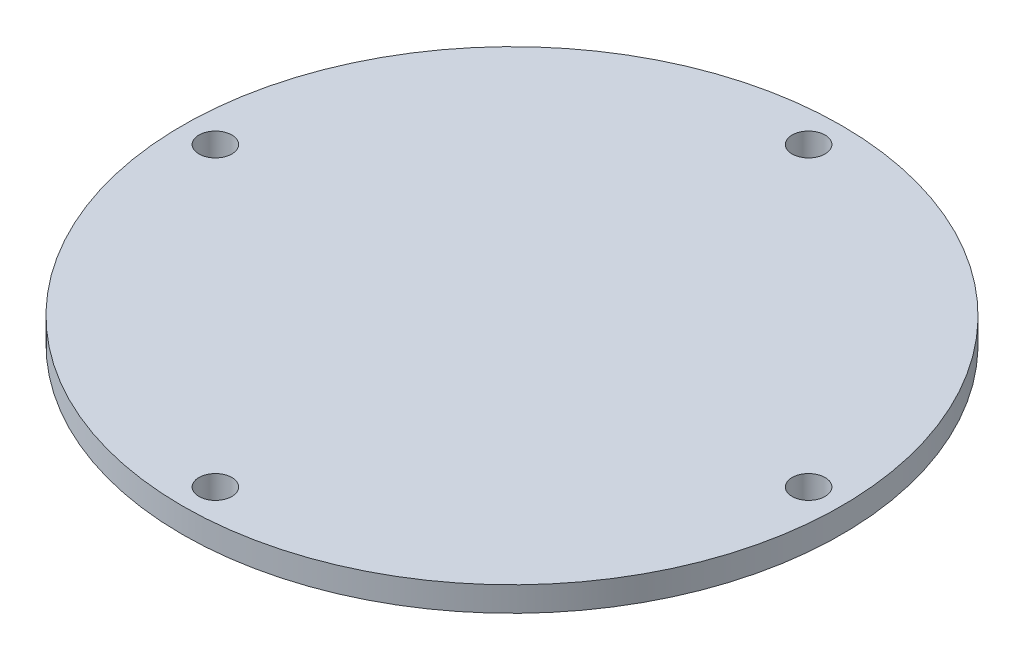
ISO-10303-21;
HEADER;
FILE_DESCRIPTION(('STEP AP214'),'2;1');
FILE_NAME('part.step','',(''),(''),'','','');
FILE_SCHEMA(('AUTOMOTIVE_DESIGN { 1 0 10303 214 1 1 1 1 }'));
ENDSEC;
DATA;
#1=APPLICATION_CONTEXT('core data for automotive mechanical design processes');
#2=APPLICATION_PROTOCOL_DEFINITION('international standard','automotive_design',2000,#1);
#3=PRODUCT_CONTEXT('',#1,'mechanical');
#4=PRODUCT('Part','Part','',(#3));
#5=PRODUCT_RELATED_PRODUCT_CATEGORY('part','',(#4));
#6=PRODUCT_DEFINITION_FORMATION('','',#4);
#7=PRODUCT_DEFINITION_CONTEXT('part definition',#1,'design');
#8=PRODUCT_DEFINITION('design','',#6,#7);
#9=PRODUCT_DEFINITION_SHAPE('','',#8);
#10=(LENGTH_UNIT() NAMED_UNIT(*) SI_UNIT(.MILLI.,.METRE.));
#11=(NAMED_UNIT(*) PLANE_ANGLE_UNIT() SI_UNIT($,.RADIAN.));
#12=(NAMED_UNIT(*) SI_UNIT($,.STERADIAN.) SOLID_ANGLE_UNIT());
#13=UNCERTAINTY_MEASURE_WITH_UNIT(LENGTH_MEASURE(1.E-05),#10,'distance_accuracy_value','');
#14=(GEOMETRIC_REPRESENTATION_CONTEXT(3) GLOBAL_UNCERTAINTY_ASSIGNED_CONTEXT((#13)) GLOBAL_UNIT_ASSIGNED_CONTEXT((#10,
#11,#12)) REPRESENTATION_CONTEXT('',''));
#15=CARTESIAN_POINT('',(0.,0.,0.));
#16=DIRECTION('',(0.,0.,1.));
#17=DIRECTION('',(1.,0.,0.));
#18=AXIS2_PLACEMENT_3D('',#15,#16,#17);
#19=CARTESIAN_POINT('',(36.000000000001,3.,-1.01656844677915E-12));
#20=DIRECTION('',(0.,-1.,0.));
#21=DIRECTION('',(0.,0.,-1.));
#22=AXIS2_PLACEMENT_3D('',#19,#20,#21);
#23=CYLINDRICAL_SURFACE('',#22,2.00000000000079);
#24=CARTESIAN_POINT('',(36.000000000001,3.,-1.01656844677915E-12));
#25=DIRECTION('',(0.,1.,0.));
#26=DIRECTION('',(0.,0.,1.));
#27=AXIS2_PLACEMENT_3D('',#24,#25,#26);
#28=CIRCLE('',#27,2.00000000000079);
#29=CARTESIAN_POINT('',(36.000000000001,3.,1.99999999999978));
#30=VERTEX_POINT('',#29);
#31=EDGE_CURVE('E46',#30,#30,#28,.T.);
#32=ORIENTED_EDGE('',*,*,#31,.T.);
#33=EDGE_LOOP('',(#32));
#34=FACE_BOUND('',#33,.T.);
#35=CARTESIAN_POINT('',(36.000000000001,0.,-1.01656844677915E-12));
#36=DIRECTION('',(0.,1.,0.));
#37=DIRECTION('',(0.,0.,1.));
#38=AXIS2_PLACEMENT_3D('',#35,#36,#37);
#39=CIRCLE('',#38,2.00000000000079);
#40=CARTESIAN_POINT('',(36.000000000001,0.,1.99999999999978));
#41=VERTEX_POINT('',#40);
#42=EDGE_CURVE('E67',#41,#41,#39,.T.);
#43=ORIENTED_EDGE('',*,*,#42,.F.);
#44=EDGE_LOOP('',(#43));
#45=FACE_BOUND('',#44,.T.);
#46=ADVANCED_FACE('F37',(#34,#45),#23,.F.);
#47=CARTESIAN_POINT('',(-35.999999999999,3.,1.02097717525608E-12));
#48=DIRECTION('',(0.,-1.,0.));
#49=DIRECTION('',(0.,0.,-1.));
#50=AXIS2_PLACEMENT_3D('',#47,#48,#49);
#51=CYLINDRICAL_SURFACE('',#50,2.00000000000163);
#52=CARTESIAN_POINT('',(-35.999999999999,3.,1.02097717525608E-12));
#53=DIRECTION('',(0.,1.,0.));
#54=DIRECTION('',(0.,0.,1.));
#55=AXIS2_PLACEMENT_3D('',#52,#53,#54);
#56=CIRCLE('',#55,2.00000000000163);
#57=CARTESIAN_POINT('',(-35.999999999999,3.,2.00000000000265));
#58=VERTEX_POINT('',#57);
#59=EDGE_CURVE('E52',#58,#58,#56,.T.);
#60=ORIENTED_EDGE('',*,*,#59,.T.);
#61=EDGE_LOOP('',(#60));
#62=FACE_BOUND('',#61,.T.);
#63=CARTESIAN_POINT('',(-35.999999999999,0.,1.02097717525608E-12));
#64=DIRECTION('',(0.,1.,0.));
#65=DIRECTION('',(0.,0.,1.));
#66=AXIS2_PLACEMENT_3D('',#63,#64,#65);
#67=CIRCLE('',#66,2.00000000000163);
#68=CARTESIAN_POINT('',(-35.999999999999,0.,2.00000000000265));
#69=VERTEX_POINT('',#68);
#70=EDGE_CURVE('E64',#69,#69,#67,.T.);
#71=ORIENTED_EDGE('',*,*,#70,.F.);
#72=EDGE_LOOP('',(#71));
#73=FACE_BOUND('',#72,.T.);
#74=ADVANCED_FACE('F90',(#62,#73),#51,.F.);
#75=CARTESIAN_POINT('',(0.,3.,0.));
#76=DIRECTION('',(0.,-1.,0.));
#77=DIRECTION('',(0.,0.,-1.));
#78=AXIS2_PLACEMENT_3D('',#75,#76,#77);
#79=CYLINDRICAL_SURFACE('',#78,40.);
#80=CARTESIAN_POINT('',(0.,3.,0.));
#81=DIRECTION('',(0.,1.,0.));
#82=DIRECTION('',(0.,0.,1.));
#83=AXIS2_PLACEMENT_3D('',#80,#81,#82);
#84=CIRCLE('',#83,40.);
#85=CARTESIAN_POINT('',(0.,3.,40.));
#86=VERTEX_POINT('',#85);
#87=EDGE_CURVE('E79',#86,#86,#84,.T.);
#88=ORIENTED_EDGE('',*,*,#87,.F.);
#89=EDGE_LOOP('',(#88));
#90=FACE_BOUND('',#89,.T.);
#91=CARTESIAN_POINT('',(0.,0.,0.));
#92=DIRECTION('',(0.,1.,0.));
#93=DIRECTION('',(0.,0.,1.));
#94=AXIS2_PLACEMENT_3D('',#91,#92,#93);
#95=CIRCLE('',#94,40.);
#96=CARTESIAN_POINT('',(0.,0.,40.));
#97=VERTEX_POINT('',#96);
#98=EDGE_CURVE('E60',#97,#97,#95,.T.);
#99=ORIENTED_EDGE('',*,*,#98,.T.);
#100=EDGE_LOOP('',(#99));
#101=FACE_BOUND('',#100,.T.);
#102=ADVANCED_FACE('F109',(#90,#101),#79,.T.);
#103=CARTESIAN_POINT('',(0.,3.,-36.));
#104=DIRECTION('',(0.,-1.,0.));
#105=DIRECTION('',(0.,0.,-1.));
#106=AXIS2_PLACEMENT_3D('',#103,#104,#105);
#107=CYLINDRICAL_SURFACE('',#106,2.);
#108=CARTESIAN_POINT('',(0.,3.,-36.));
#109=DIRECTION('',(0.,1.,0.));
#110=DIRECTION('',(0.,0.,1.));
#111=AXIS2_PLACEMENT_3D('',#108,#109,#110);
#112=CIRCLE('',#111,2.);
#113=CARTESIAN_POINT('',(0.,3.,-34.));
#114=VERTEX_POINT('',#113);
#115=EDGE_CURVE('E74',#114,#114,#112,.T.);
#116=ORIENTED_EDGE('',*,*,#115,.T.);
#117=EDGE_LOOP('',(#116));
#118=FACE_BOUND('',#117,.T.);
#119=CARTESIAN_POINT('',(0.,0.,-36.));
#120=DIRECTION('',(0.,1.,0.));
#121=DIRECTION('',(0.,0.,1.));
#122=AXIS2_PLACEMENT_3D('',#119,#120,#121);
#123=CIRCLE('',#122,2.);
#124=CARTESIAN_POINT('',(0.,0.,-34.));
#125=VERTEX_POINT('',#124);
#126=EDGE_CURVE('E56',#125,#125,#123,.T.);
#127=ORIENTED_EDGE('',*,*,#126,.F.);
#128=EDGE_LOOP('',(#127));
#129=FACE_BOUND('',#128,.T.);
#130=ADVANCED_FACE('F39',(#118,#129),#107,.F.);
#131=CARTESIAN_POINT('',(2.03362675227796E-12,3.,36.));
#132=DIRECTION('',(0.,-1.,0.));
#133=DIRECTION('',(0.,0.,-1.));
#134=AXIS2_PLACEMENT_3D('',#131,#132,#133);
#135=CYLINDRICAL_SURFACE('',#134,2.00000000000219);
#136=CARTESIAN_POINT('',(2.03362675227796E-12,3.,36.));
#137=DIRECTION('',(0.,1.,0.));
#138=DIRECTION('',(0.,0.,1.));
#139=AXIS2_PLACEMENT_3D('',#136,#137,#138);
#140=CIRCLE('',#139,2.00000000000219);
#141=CARTESIAN_POINT('',(2.03362675227796E-12,3.,38.0000000000022));
#142=VERTEX_POINT('',#141);
#143=EDGE_CURVE('E10',#142,#142,#140,.T.);
#144=ORIENTED_EDGE('',*,*,#143,.T.);
#145=EDGE_LOOP('',(#144));
#146=FACE_BOUND('',#145,.T.);
#147=CARTESIAN_POINT('',(2.03362675227796E-12,0.,36.));
#148=DIRECTION('',(0.,1.,0.));
#149=DIRECTION('',(0.,0.,1.));
#150=AXIS2_PLACEMENT_3D('',#147,#148,#149);
#151=CIRCLE('',#150,2.00000000000219);
#152=CARTESIAN_POINT('',(2.03362675227796E-12,0.,38.0000000000022));
#153=VERTEX_POINT('',#152);
#154=EDGE_CURVE('E41',#153,#153,#151,.T.);
#155=ORIENTED_EDGE('',*,*,#154,.F.);
#156=EDGE_LOOP('',(#155));
#157=FACE_BOUND('',#156,.T.);
#158=ADVANCED_FACE('F97',(#146,#157),#135,.F.);
#159=CARTESIAN_POINT('',(0.,3.,0.));
#160=DIRECTION('',(0.,1.,0.));
#161=DIRECTION('',(0.,0.,1.));
#162=AXIS2_PLACEMENT_3D('',#159,#160,#161);
#163=PLANE('',#162);
#164=ORIENTED_EDGE('',*,*,#115,.F.);
#165=EDGE_LOOP('',(#164));
#166=FACE_BOUND('',#165,.T.);
#167=ORIENTED_EDGE('',*,*,#87,.T.);
#168=EDGE_LOOP('',(#167));
#169=FACE_BOUND('',#168,.T.);
#170=ORIENTED_EDGE('',*,*,#59,.F.);
#171=EDGE_LOOP('',(#170));
#172=FACE_BOUND('',#171,.T.);
#173=ORIENTED_EDGE('',*,*,#31,.F.);
#174=EDGE_LOOP('',(#173));
#175=FACE_BOUND('',#174,.T.);
#176=ORIENTED_EDGE('',*,*,#143,.F.);
#177=EDGE_LOOP('',(#176));
#178=FACE_BOUND('',#177,.T.);
#179=ADVANCED_FACE('F93',(#166,#169,#172,#175,#178),#163,.T.);
#180=CARTESIAN_POINT('',(0.,0.,0.));
#181=DIRECTION('',(0.,1.,0.));
#182=DIRECTION('',(0.,0.,1.));
#183=AXIS2_PLACEMENT_3D('',#180,#181,#182);
#184=PLANE('',#183);
#185=ORIENTED_EDGE('',*,*,#126,.T.);
#186=EDGE_LOOP('',(#185));
#187=FACE_BOUND('',#186,.T.);
#188=ORIENTED_EDGE('',*,*,#98,.F.);
#189=EDGE_LOOP('',(#188));
#190=FACE_BOUND('',#189,.T.);
#191=ORIENTED_EDGE('',*,*,#70,.T.);
#192=EDGE_LOOP('',(#191));
#193=FACE_BOUND('',#192,.T.);
#194=ORIENTED_EDGE('',*,*,#42,.T.);
#195=EDGE_LOOP('',(#194));
#196=FACE_BOUND('',#195,.T.);
#197=ORIENTED_EDGE('',*,*,#154,.T.);
#198=EDGE_LOOP('',(#197));
#199=FACE_BOUND('',#198,.T.);
#200=ADVANCED_FACE('F96',(#187,#190,#193,#196,#199),#184,.F.);
#201=CLOSED_SHELL('',(#46,#74,#102,#130,#158,#179,#200));
#202=MANIFOLD_SOLID_BREP('B2',#201);
#203=ADVANCED_BREP_SHAPE_REPRESENTATION('',(#18,#202),#14);
#204=SHAPE_DEFINITION_REPRESENTATION(#9,#203);
ENDSEC;
END-ISO-10303-21;
